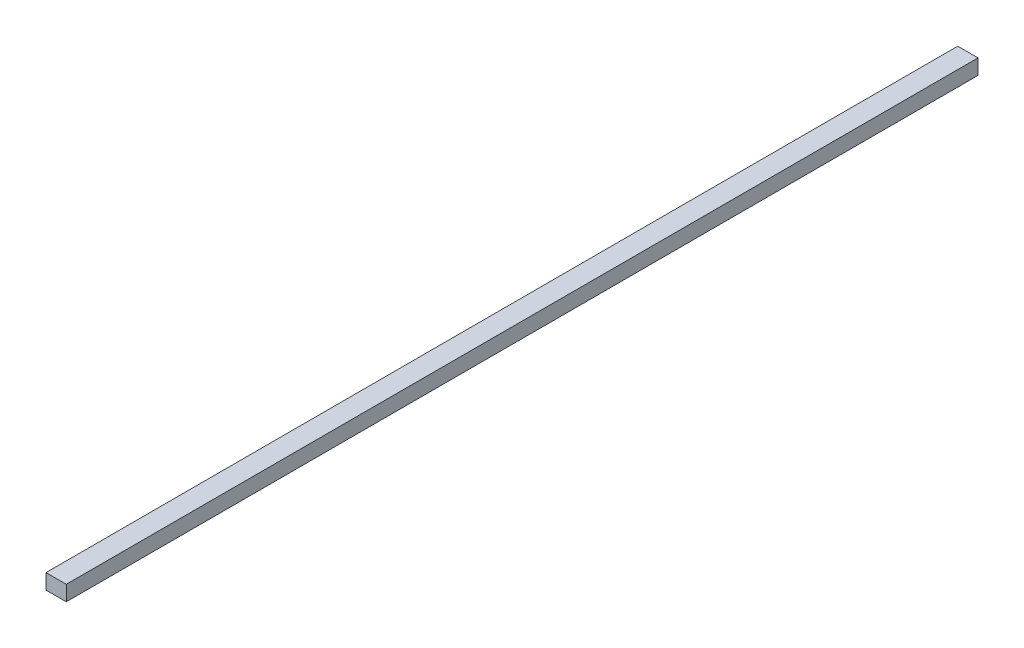
ISO-10303-21;
HEADER;
FILE_DESCRIPTION(('STEP AP214'),'2;1');
FILE_NAME('part.step','',(''),(''),'','','');
FILE_SCHEMA(('AUTOMOTIVE_DESIGN { 1 0 10303 214 1 1 1 1 }'));
ENDSEC;
DATA;
#1=APPLICATION_CONTEXT('core data for automotive mechanical design processes');
#2=APPLICATION_PROTOCOL_DEFINITION('international standard','automotive_design',2000,#1);
#3=PRODUCT_CONTEXT('',#1,'mechanical');
#4=PRODUCT('Part','Part','',(#3));
#5=PRODUCT_RELATED_PRODUCT_CATEGORY('part','',(#4));
#6=PRODUCT_DEFINITION_FORMATION('','',#4);
#7=PRODUCT_DEFINITION_CONTEXT('part definition',#1,'design');
#8=PRODUCT_DEFINITION('design','',#6,#7);
#9=PRODUCT_DEFINITION_SHAPE('','',#8);
#10=(LENGTH_UNIT() NAMED_UNIT(*) SI_UNIT(.MILLI.,.METRE.));
#11=(NAMED_UNIT(*) PLANE_ANGLE_UNIT() SI_UNIT($,.RADIAN.));
#12=(NAMED_UNIT(*) SI_UNIT($,.STERADIAN.) SOLID_ANGLE_UNIT());
#13=UNCERTAINTY_MEASURE_WITH_UNIT(LENGTH_MEASURE(1.E-05),#10,'distance_accuracy_value','');
#14=(GEOMETRIC_REPRESENTATION_CONTEXT(3) GLOBAL_UNCERTAINTY_ASSIGNED_CONTEXT((#13)) GLOBAL_UNIT_ASSIGNED_CONTEXT((#10,
#11,#12)) REPRESENTATION_CONTEXT('',''));
#15=CARTESIAN_POINT('',(0.,0.,0.));
#16=DIRECTION('',(0.,0.,1.));
#17=DIRECTION('',(1.,0.,0.));
#18=AXIS2_PLACEMENT_3D('',#15,#16,#17);
#19=CARTESIAN_POINT('',(0.,0.,900.));
#20=DIRECTION('',(1.,0.,0.));
#21=DIRECTION('',(0.,0.,-1.));
#22=AXIS2_PLACEMENT_3D('',#19,#20,#21);
#23=PLANE('',#22);
#24=DIRECTION('',(0.,-1.,0.));
#25=VECTOR('',#24,1.);
#26=CARTESIAN_POINT('',(0.,0.,0.));
#27=LINE('',#26,#25);
#28=CARTESIAN_POINT('',(0.,15.,0.));
#29=VERTEX_POINT('',#28);
#30=CARTESIAN_POINT('',(0.,0.,0.));
#31=VERTEX_POINT('',#30);
#32=EDGE_CURVE('E107',#29,#31,#27,.T.);
#33=ORIENTED_EDGE('',*,*,#32,.T.);
#34=DIRECTION('',(0.,0.,-1.));
#35=VECTOR('',#34,1.);
#36=CARTESIAN_POINT('',(0.,0.,900.));
#37=LINE('',#36,#35);
#38=CARTESIAN_POINT('',(0.,0.,900.));
#39=VERTEX_POINT('',#38);
#40=EDGE_CURVE('E11',#39,#31,#37,.T.);
#41=ORIENTED_EDGE('',*,*,#40,.F.);
#42=DIRECTION('',(0.,-1.,0.));
#43=VECTOR('',#42,1.);
#44=CARTESIAN_POINT('',(0.,0.,900.));
#45=LINE('',#44,#43);
#46=CARTESIAN_POINT('',(0.,15.,900.));
#47=VERTEX_POINT('',#46);
#48=EDGE_CURVE('E96',#47,#39,#45,.T.);
#49=ORIENTED_EDGE('',*,*,#48,.F.);
#50=DIRECTION('',(0.,0.,-1.));
#51=VECTOR('',#50,1.);
#52=CARTESIAN_POINT('',(0.,15.,900.));
#53=LINE('',#52,#51);
#54=EDGE_CURVE('E102',#47,#29,#53,.T.);
#55=ORIENTED_EDGE('',*,*,#54,.T.);
#56=EDGE_LOOP('',(#33,#41,#49,#55));
#57=FACE_BOUND('',#56,.T.);
#58=ADVANCED_FACE('F44',(#57),#23,.F.);
#59=CARTESIAN_POINT('',(0.,0.,900.));
#60=DIRECTION('',(0.,1.,0.));
#61=DIRECTION('',(0.,0.,1.));
#62=AXIS2_PLACEMENT_3D('',#59,#60,#61);
#63=PLANE('',#62);
#64=DIRECTION('',(1.,0.,0.));
#65=VECTOR('',#64,1.);
#66=CARTESIAN_POINT('',(0.,0.,0.));
#67=LINE('',#66,#65);
#68=CARTESIAN_POINT('',(20.,0.,0.));
#69=VERTEX_POINT('',#68);
#70=EDGE_CURVE('E99',#31,#69,#67,.T.);
#71=ORIENTED_EDGE('',*,*,#70,.T.);
#72=DIRECTION('',(0.,0.,-1.));
#73=VECTOR('',#72,1.);
#74=CARTESIAN_POINT('',(20.,0.,900.));
#75=LINE('',#74,#73);
#76=CARTESIAN_POINT('',(20.,0.,900.));
#77=VERTEX_POINT('',#76);
#78=EDGE_CURVE('E52',#77,#69,#75,.T.);
#79=ORIENTED_EDGE('',*,*,#78,.F.);
#80=DIRECTION('',(1.,0.,0.));
#81=VECTOR('',#80,1.);
#82=CARTESIAN_POINT('',(0.,0.,900.));
#83=LINE('',#82,#81);
#84=EDGE_CURVE('E93',#39,#77,#83,.T.);
#85=ORIENTED_EDGE('',*,*,#84,.F.);
#86=ORIENTED_EDGE('',*,*,#40,.T.);
#87=EDGE_LOOP('',(#71,#79,#85,#86));
#88=FACE_BOUND('',#87,.T.);
#89=ADVANCED_FACE('F97',(#88),#63,.F.);
#90=CARTESIAN_POINT('',(20.,0.,900.));
#91=DIRECTION('',(-1.,0.,0.));
#92=DIRECTION('',(0.,0.,1.));
#93=AXIS2_PLACEMENT_3D('',#90,#91,#92);
#94=PLANE('',#93);
#95=DIRECTION('',(0.,1.,0.));
#96=VECTOR('',#95,1.);
#97=CARTESIAN_POINT('',(20.,0.,0.));
#98=LINE('',#97,#96);
#99=CARTESIAN_POINT('',(20.,15.,0.));
#100=VERTEX_POINT('',#99);
#101=EDGE_CURVE('E79',#69,#100,#98,.T.);
#102=ORIENTED_EDGE('',*,*,#101,.T.);
#103=DIRECTION('',(0.,0.,-1.));
#104=VECTOR('',#103,1.);
#105=CARTESIAN_POINT('',(20.,15.,900.));
#106=LINE('',#105,#104);
#107=CARTESIAN_POINT('',(20.,15.,900.));
#108=VERTEX_POINT('',#107);
#109=EDGE_CURVE('E101',#108,#100,#106,.T.);
#110=ORIENTED_EDGE('',*,*,#109,.F.);
#111=DIRECTION('',(0.,1.,0.));
#112=VECTOR('',#111,1.);
#113=CARTESIAN_POINT('',(20.,0.,900.));
#114=LINE('',#113,#112);
#115=EDGE_CURVE('E94',#77,#108,#114,.T.);
#116=ORIENTED_EDGE('',*,*,#115,.F.);
#117=ORIENTED_EDGE('',*,*,#78,.T.);
#118=EDGE_LOOP('',(#102,#110,#116,#117));
#119=FACE_BOUND('',#118,.T.);
#120=ADVANCED_FACE('F105',(#119),#94,.F.);
#121=CARTESIAN_POINT('',(0.,15.,900.));
#122=DIRECTION('',(0.,-1.,0.));
#123=DIRECTION('',(0.,0.,-1.));
#124=AXIS2_PLACEMENT_3D('',#121,#122,#123);
#125=PLANE('',#124);
#126=DIRECTION('',(-1.,0.,0.));
#127=VECTOR('',#126,1.);
#128=CARTESIAN_POINT('',(0.,15.,0.));
#129=LINE('',#128,#127);
#130=EDGE_CURVE('E83',#100,#29,#129,.T.);
#131=ORIENTED_EDGE('',*,*,#130,.T.);
#132=ORIENTED_EDGE('',*,*,#54,.F.);
#133=DIRECTION('',(-1.,0.,0.));
#134=VECTOR('',#133,1.);
#135=CARTESIAN_POINT('',(0.,15.,900.));
#136=LINE('',#135,#134);
#137=EDGE_CURVE('E62',#108,#47,#136,.T.);
#138=ORIENTED_EDGE('',*,*,#137,.F.);
#139=ORIENTED_EDGE('',*,*,#109,.T.);
#140=EDGE_LOOP('',(#131,#132,#138,#139));
#141=FACE_BOUND('',#140,.T.);
#142=ADVANCED_FACE('F113',(#141),#125,.F.);
#143=CARTESIAN_POINT('',(0.,0.,900.));
#144=DIRECTION('',(0.,0.,-1.));
#145=DIRECTION('',(-1.,0.,0.));
#146=AXIS2_PLACEMENT_3D('',#143,#144,#145);
#147=PLANE('',#146);
#148=ORIENTED_EDGE('',*,*,#48,.T.);
#149=ORIENTED_EDGE('',*,*,#84,.T.);
#150=ORIENTED_EDGE('',*,*,#115,.T.);
#151=ORIENTED_EDGE('',*,*,#137,.T.);
#152=EDGE_LOOP('',(#148,#149,#150,#151));
#153=FACE_BOUND('',#152,.T.);
#154=ADVANCED_FACE('F95',(#153),#147,.F.);
#155=CARTESIAN_POINT('',(0.,0.,0.));
#156=DIRECTION('',(0.,0.,-1.));
#157=DIRECTION('',(-1.,0.,0.));
#158=AXIS2_PLACEMENT_3D('',#155,#156,#157);
#159=PLANE('',#158);
#160=ORIENTED_EDGE('',*,*,#32,.F.);
#161=ORIENTED_EDGE('',*,*,#130,.F.);
#162=ORIENTED_EDGE('',*,*,#101,.F.);
#163=ORIENTED_EDGE('',*,*,#70,.F.);
#164=EDGE_LOOP('',(#160,#161,#162,#163));
#165=FACE_BOUND('',#164,.T.);
#166=ADVANCED_FACE('F119',(#165),#159,.T.);
#167=CLOSED_SHELL('',(#58,#89,#120,#142,#154,#166));
#168=MANIFOLD_SOLID_BREP('B2',#167);
#169=ADVANCED_BREP_SHAPE_REPRESENTATION('',(#18,#168),#14);
#170=SHAPE_DEFINITION_REPRESENTATION(#9,#169);
ENDSEC;
END-ISO-10303-21;
